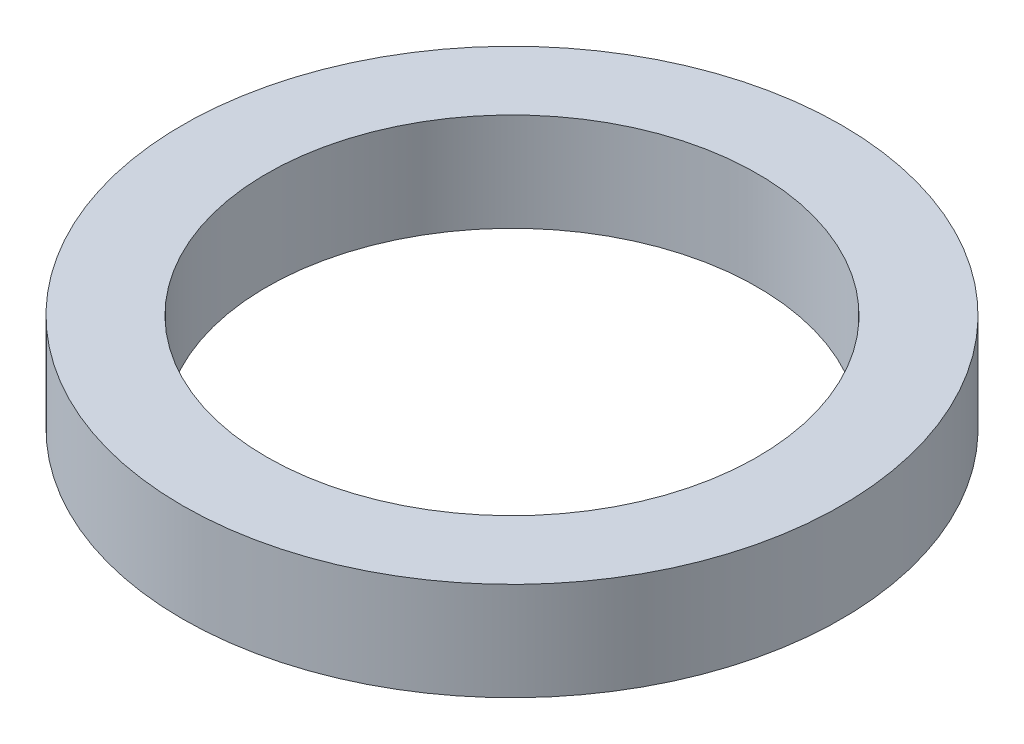
ISO-10303-21;
HEADER;
FILE_DESCRIPTION(('STEP AP214'),'2;1');
FILE_NAME('part.step','',(''),(''),'','','');
FILE_SCHEMA(('AUTOMOTIVE_DESIGN { 1 0 10303 214 1 1 1 1 }'));
ENDSEC;
DATA;
#1=APPLICATION_CONTEXT('core data for automotive mechanical design processes');
#2=APPLICATION_PROTOCOL_DEFINITION('international standard','automotive_design',2000,#1);
#3=PRODUCT_CONTEXT('',#1,'mechanical');
#4=PRODUCT('Part','Part','',(#3));
#5=PRODUCT_RELATED_PRODUCT_CATEGORY('part','',(#4));
#6=PRODUCT_DEFINITION_FORMATION('','',#4);
#7=PRODUCT_DEFINITION_CONTEXT('part definition',#1,'design');
#8=PRODUCT_DEFINITION('design','',#6,#7);
#9=PRODUCT_DEFINITION_SHAPE('','',#8);
#10=(LENGTH_UNIT() NAMED_UNIT(*) SI_UNIT(.MILLI.,.METRE.));
#11=(NAMED_UNIT(*) PLANE_ANGLE_UNIT() SI_UNIT($,.RADIAN.));
#12=(NAMED_UNIT(*) SI_UNIT($,.STERADIAN.) SOLID_ANGLE_UNIT());
#13=UNCERTAINTY_MEASURE_WITH_UNIT(LENGTH_MEASURE(1.E-05),#10,'distance_accuracy_value','');
#14=(GEOMETRIC_REPRESENTATION_CONTEXT(3) GLOBAL_UNCERTAINTY_ASSIGNED_CONTEXT((#13)) GLOBAL_UNIT_ASSIGNED_CONTEXT((#10,
#11,#12)) REPRESENTATION_CONTEXT('',''));
#15=CARTESIAN_POINT('',(0.,0.,0.));
#16=DIRECTION('',(0.,0.,1.));
#17=DIRECTION('',(1.,0.,0.));
#18=AXIS2_PLACEMENT_3D('',#15,#16,#17);
#19=CARTESIAN_POINT('',(0.,7.,0.));
#20=DIRECTION('',(0.,1.,0.));
#21=DIRECTION('',(0.,0.,1.));
#22=AXIS2_PLACEMENT_3D('',#19,#20,#21);
#23=PLANE('',#22);
#24=CARTESIAN_POINT('',(0.,7.,0.));
#25=DIRECTION('',(0.,1.,0.));
#26=DIRECTION('',(0.,0.,1.));
#27=AXIS2_PLACEMENT_3D('',#24,#25,#26);
#28=CIRCLE('',#27,23.5);
#29=CARTESIAN_POINT('',(0.,7.,23.5));
#30=VERTEX_POINT('',#29);
#31=EDGE_CURVE('E10',#30,#30,#28,.T.);
#32=ORIENTED_EDGE('',*,*,#31,.T.);
#33=EDGE_LOOP('',(#32));
#34=FACE_BOUND('',#33,.T.);
#35=CARTESIAN_POINT('',(0.,7.,0.));
#36=DIRECTION('',(0.,1.,0.));
#37=DIRECTION('',(0.,0.,1.));
#38=AXIS2_PLACEMENT_3D('',#35,#36,#37);
#39=CIRCLE('',#38,17.5);
#40=CARTESIAN_POINT('',(0.,7.,17.5));
#41=VERTEX_POINT('',#40);
#42=EDGE_CURVE('E46',#41,#41,#39,.T.);
#43=ORIENTED_EDGE('',*,*,#42,.F.);
#44=EDGE_LOOP('',(#43));
#45=FACE_BOUND('',#44,.T.);
#46=ADVANCED_FACE('F35',(#34,#45),#23,.T.);
#47=CARTESIAN_POINT('',(0.,0.,0.));
#48=DIRECTION('',(0.,1.,0.));
#49=DIRECTION('',(0.,0.,1.));
#50=AXIS2_PLACEMENT_3D('',#47,#48,#49);
#51=PLANE('',#50);
#52=CARTESIAN_POINT('',(0.,0.,0.));
#53=DIRECTION('',(0.,1.,0.));
#54=DIRECTION('',(0.,0.,1.));
#55=AXIS2_PLACEMENT_3D('',#52,#53,#54);
#56=CIRCLE('',#55,23.5);
#57=CARTESIAN_POINT('',(0.,0.,23.5));
#58=VERTEX_POINT('',#57);
#59=EDGE_CURVE('E39',#58,#58,#56,.T.);
#60=ORIENTED_EDGE('',*,*,#59,.F.);
#61=EDGE_LOOP('',(#60));
#62=FACE_BOUND('',#61,.T.);
#63=CARTESIAN_POINT('',(0.,0.,0.));
#64=DIRECTION('',(0.,1.,0.));
#65=DIRECTION('',(0.,0.,1.));
#66=AXIS2_PLACEMENT_3D('',#63,#64,#65);
#67=CIRCLE('',#66,17.5);
#68=CARTESIAN_POINT('',(0.,0.,17.5));
#69=VERTEX_POINT('',#68);
#70=EDGE_CURVE('E48',#69,#69,#67,.T.);
#71=ORIENTED_EDGE('',*,*,#70,.T.);
#72=EDGE_LOOP('',(#71));
#73=FACE_BOUND('',#72,.T.);
#74=ADVANCED_FACE('F58',(#62,#73),#51,.F.);
#75=CARTESIAN_POINT('',(0.,7.,0.));
#76=DIRECTION('',(0.,-1.,0.));
#77=DIRECTION('',(0.,0.,-1.));
#78=AXIS2_PLACEMENT_3D('',#75,#76,#77);
#79=CYLINDRICAL_SURFACE('',#78,23.5);
#80=ORIENTED_EDGE('',*,*,#31,.F.);
#81=EDGE_LOOP('',(#80));
#82=FACE_BOUND('',#81,.T.);
#83=ORIENTED_EDGE('',*,*,#59,.T.);
#84=EDGE_LOOP('',(#83));
#85=FACE_BOUND('',#84,.T.);
#86=ADVANCED_FACE('F37',(#82,#85),#79,.T.);
#87=CARTESIAN_POINT('',(0.,7.,0.));
#88=DIRECTION('',(0.,-1.,0.));
#89=DIRECTION('',(0.,0.,-1.));
#90=AXIS2_PLACEMENT_3D('',#87,#88,#89);
#91=CYLINDRICAL_SURFACE('',#90,17.5);
#92=ORIENTED_EDGE('',*,*,#42,.T.);
#93=EDGE_LOOP('',(#92));
#94=FACE_BOUND('',#93,.T.);
#95=ORIENTED_EDGE('',*,*,#70,.F.);
#96=EDGE_LOOP('',(#95));
#97=FACE_BOUND('',#96,.T.);
#98=ADVANCED_FACE('F54',(#94,#97),#91,.F.);
#99=CLOSED_SHELL('',(#46,#74,#86,#98));
#100=MANIFOLD_SOLID_BREP('B2',#99);
#101=ADVANCED_BREP_SHAPE_REPRESENTATION('',(#18,#100),#14);
#102=SHAPE_DEFINITION_REPRESENTATION(#9,#101);
ENDSEC;
END-ISO-10303-21;
